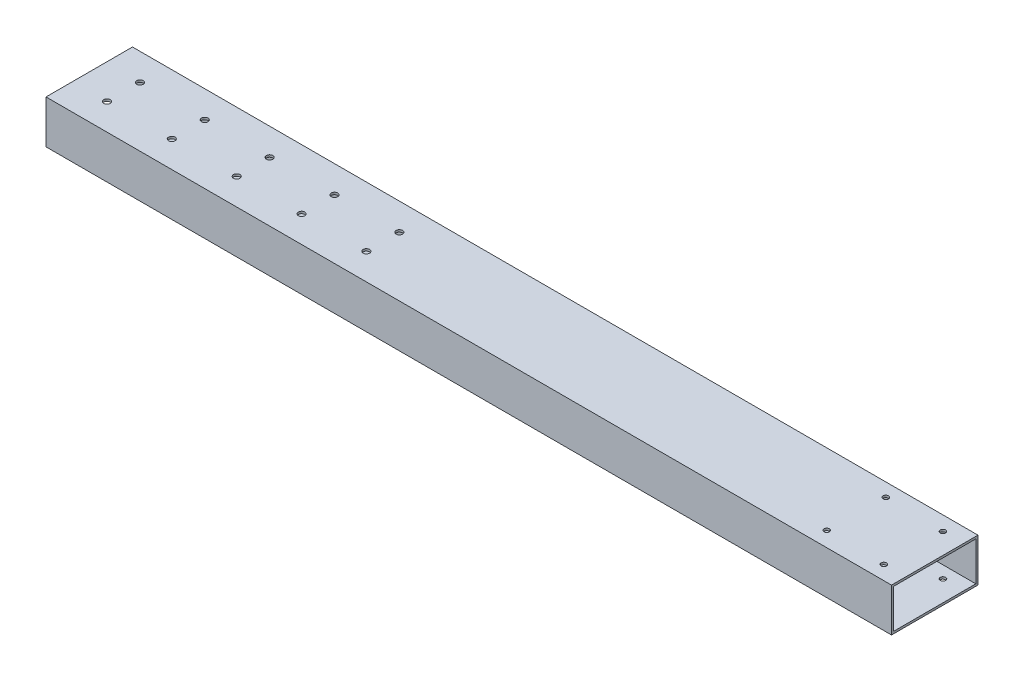
ISO-10303-21;
HEADER;
FILE_DESCRIPTION(('STEP AP214'),'2;1');
FILE_NAME('part.step','',(''),(''),'','','');
FILE_SCHEMA(('AUTOMOTIVE_DESIGN { 1 0 10303 214 1 1 1 1 }'));
ENDSEC;
DATA;
#1=APPLICATION_CONTEXT('core data for automotive mechanical design processes');
#2=APPLICATION_PROTOCOL_DEFINITION('international standard','automotive_design',2000,#1);
#3=PRODUCT_CONTEXT('',#1,'mechanical');
#4=PRODUCT('Part','Part','',(#3));
#5=PRODUCT_RELATED_PRODUCT_CATEGORY('part','',(#4));
#6=PRODUCT_DEFINITION_FORMATION('','',#4);
#7=PRODUCT_DEFINITION_CONTEXT('part definition',#1,'design');
#8=PRODUCT_DEFINITION('design','',#6,#7);
#9=PRODUCT_DEFINITION_SHAPE('','',#8);
#10=(LENGTH_UNIT() NAMED_UNIT(*) SI_UNIT(.MILLI.,.METRE.));
#11=(NAMED_UNIT(*) PLANE_ANGLE_UNIT() SI_UNIT($,.RADIAN.));
#12=(NAMED_UNIT(*) SI_UNIT($,.STERADIAN.) SOLID_ANGLE_UNIT());
#13=UNCERTAINTY_MEASURE_WITH_UNIT(LENGTH_MEASURE(1.E-05),#10,'distance_accuracy_value','');
#14=(GEOMETRIC_REPRESENTATION_CONTEXT(3) GLOBAL_UNCERTAINTY_ASSIGNED_CONTEXT((#13)) GLOBAL_UNIT_ASSIGNED_CONTEXT((#10,
#11,#12)) REPRESENTATION_CONTEXT('',''));
#15=CARTESIAN_POINT('',(0.,0.,0.));
#16=DIRECTION('',(0.,0.,1.));
#17=DIRECTION('',(1.,0.,0.));
#18=AXIS2_PLACEMENT_3D('',#15,#16,#17);
#19=CARTESIAN_POINT('',(391.,0.,0.));
#20=DIRECTION('',(-1.,0.,0.));
#21=DIRECTION('',(0.,0.,1.));
#22=AXIS2_PLACEMENT_3D('',#19,#20,#21);
#23=PLANE('',#22);
#24=DIRECTION('',(0.,1.,0.));
#25=VECTOR('',#24,1.);
#26=CARTESIAN_POINT('',(391.,-10.,-20.));
#27=LINE('',#26,#25);
#28=CARTESIAN_POINT('',(391.,-10.,-20.));
#29=VERTEX_POINT('',#28);
#30=CARTESIAN_POINT('',(391.,10.,-20.));
#31=VERTEX_POINT('',#30);
#32=EDGE_CURVE('E141',#29,#31,#27,.T.);
#33=ORIENTED_EDGE('',*,*,#32,.T.);
#34=DIRECTION('',(0.,0.,1.));
#35=VECTOR('',#34,1.);
#36=CARTESIAN_POINT('',(391.,10.,20.));
#37=LINE('',#36,#35);
#38=CARTESIAN_POINT('',(391.,10.,20.));
#39=VERTEX_POINT('',#38);
#40=EDGE_CURVE('E144',#31,#39,#37,.T.);
#41=ORIENTED_EDGE('',*,*,#40,.T.);
#42=DIRECTION('',(0.,-1.,0.));
#43=VECTOR('',#42,1.);
#44=CARTESIAN_POINT('',(391.,-10.,20.));
#45=LINE('',#44,#43);
#46=CARTESIAN_POINT('',(391.,-10.,20.));
#47=VERTEX_POINT('',#46);
#48=EDGE_CURVE('E147',#39,#47,#45,.T.);
#49=ORIENTED_EDGE('',*,*,#48,.T.);
#50=DIRECTION('',(0.,0.,-1.));
#51=VECTOR('',#50,1.);
#52=CARTESIAN_POINT('',(391.,-10.,20.));
#53=LINE('',#52,#51);
#54=EDGE_CURVE('E149',#47,#29,#53,.T.);
#55=ORIENTED_EDGE('',*,*,#54,.T.);
#56=EDGE_LOOP('',(#33,#41,#49,#55));
#57=FACE_BOUND('',#56,.T.);
#58=DIRECTION('',(0.,1.,0.));
#59=VECTOR('',#58,1.);
#60=CARTESIAN_POINT('',(391.,0.,-19.));
#61=LINE('',#60,#59);
#62=CARTESIAN_POINT('',(391.,-9.00000000000001,-19.));
#63=VERTEX_POINT('',#62);
#64=CARTESIAN_POINT('',(391.,9.,-19.));
#65=VERTEX_POINT('',#64);
#66=EDGE_CURVE('E129',#63,#65,#61,.T.);
#67=ORIENTED_EDGE('',*,*,#66,.F.);
#68=DIRECTION('',(0.,0.,-1.));
#69=VECTOR('',#68,1.);
#70=CARTESIAN_POINT('',(391.,-9.00000000000001,0.));
#71=LINE('',#70,#69);
#72=CARTESIAN_POINT('',(391.,-9.00000000000001,19.));
#73=VERTEX_POINT('',#72);
#74=EDGE_CURVE('E113',#73,#63,#71,.T.);
#75=ORIENTED_EDGE('',*,*,#74,.F.);
#76=DIRECTION('',(0.,-1.,0.));
#77=VECTOR('',#76,1.);
#78=CARTESIAN_POINT('',(391.,0.,19.));
#79=LINE('',#78,#77);
#80=CARTESIAN_POINT('',(391.,9.,19.));
#81=VERTEX_POINT('',#80);
#82=EDGE_CURVE('E138',#81,#73,#79,.T.);
#83=ORIENTED_EDGE('',*,*,#82,.F.);
#84=DIRECTION('',(0.,0.,1.));
#85=VECTOR('',#84,1.);
#86=CARTESIAN_POINT('',(391.,9.,0.));
#87=LINE('',#86,#85);
#88=EDGE_CURVE('E131',#65,#81,#87,.T.);
#89=ORIENTED_EDGE('',*,*,#88,.F.);
#90=EDGE_LOOP('',(#67,#75,#83,#89));
#91=FACE_BOUND('',#90,.T.);
#92=ADVANCED_FACE('F41',(#57,#91),#23,.F.);
#93=CARTESIAN_POINT('',(0.,0.,0.));
#94=DIRECTION('',(-1.,0.,0.));
#95=DIRECTION('',(0.,0.,1.));
#96=AXIS2_PLACEMENT_3D('',#93,#94,#95);
#97=PLANE('',#96);
#98=DIRECTION('',(0.,1.,0.));
#99=VECTOR('',#98,1.);
#100=CARTESIAN_POINT('',(0.,-10.,-20.));
#101=LINE('',#100,#99);
#102=CARTESIAN_POINT('',(0.,-10.,-20.));
#103=VERTEX_POINT('',#102);
#104=CARTESIAN_POINT('',(0.,10.,-20.));
#105=VERTEX_POINT('',#104);
#106=EDGE_CURVE('E152',#103,#105,#101,.T.);
#107=ORIENTED_EDGE('',*,*,#106,.F.);
#108=DIRECTION('',(0.,0.,-1.));
#109=VECTOR('',#108,1.);
#110=CARTESIAN_POINT('',(0.,-10.,20.));
#111=LINE('',#110,#109);
#112=CARTESIAN_POINT('',(0.,-10.,20.));
#113=VERTEX_POINT('',#112);
#114=EDGE_CURVE('E145',#113,#103,#111,.T.);
#115=ORIENTED_EDGE('',*,*,#114,.F.);
#116=DIRECTION('',(0.,-1.,0.));
#117=VECTOR('',#116,1.);
#118=CARTESIAN_POINT('',(0.,-10.,20.));
#119=LINE('',#118,#117);
#120=CARTESIAN_POINT('',(0.,10.,20.));
#121=VERTEX_POINT('',#120);
#122=EDGE_CURVE('E157',#121,#113,#119,.T.);
#123=ORIENTED_EDGE('',*,*,#122,.F.);
#124=DIRECTION('',(0.,0.,1.));
#125=VECTOR('',#124,1.);
#126=CARTESIAN_POINT('',(0.,10.,20.));
#127=LINE('',#126,#125);
#128=EDGE_CURVE('E155',#105,#121,#127,.T.);
#129=ORIENTED_EDGE('',*,*,#128,.F.);
#130=EDGE_LOOP('',(#107,#115,#123,#129));
#131=FACE_BOUND('',#130,.T.);
#132=DIRECTION('',(0.,0.,-1.));
#133=VECTOR('',#132,1.);
#134=CARTESIAN_POINT('',(0.,-9.00000000000001,0.));
#135=LINE('',#134,#133);
#136=CARTESIAN_POINT('',(0.,-9.00000000000001,19.));
#137=VERTEX_POINT('',#136);
#138=CARTESIAN_POINT('',(0.,-9.00000000000001,-19.));
#139=VERTEX_POINT('',#138);
#140=EDGE_CURVE('E111',#137,#139,#135,.T.);
#141=ORIENTED_EDGE('',*,*,#140,.T.);
#142=DIRECTION('',(0.,1.,0.));
#143=VECTOR('',#142,1.);
#144=CARTESIAN_POINT('',(0.,0.,-19.));
#145=LINE('',#144,#143);
#146=CARTESIAN_POINT('',(0.,9.,-19.));
#147=VERTEX_POINT('',#146);
#148=EDGE_CURVE('E119',#139,#147,#145,.T.);
#149=ORIENTED_EDGE('',*,*,#148,.T.);
#150=DIRECTION('',(0.,0.,1.));
#151=VECTOR('',#150,1.);
#152=CARTESIAN_POINT('',(0.,9.,0.));
#153=LINE('',#152,#151);
#154=CARTESIAN_POINT('',(0.,9.,19.));
#155=VERTEX_POINT('',#154);
#156=EDGE_CURVE('E125',#147,#155,#153,.T.);
#157=ORIENTED_EDGE('',*,*,#156,.T.);
#158=DIRECTION('',(0.,-1.,0.));
#159=VECTOR('',#158,1.);
#160=CARTESIAN_POINT('',(0.,0.,19.));
#161=LINE('',#160,#159);
#162=EDGE_CURVE('E65',#155,#137,#161,.T.);
#163=ORIENTED_EDGE('',*,*,#162,.T.);
#164=EDGE_LOOP('',(#141,#149,#157,#163));
#165=FACE_BOUND('',#164,.T.);
#166=ADVANCED_FACE('F128',(#131,#165),#97,.T.);
#167=CARTESIAN_POINT('',(391.,-10.,-20.));
#168=DIRECTION('',(0.,0.,1.));
#169=DIRECTION('',(1.,0.,0.));
#170=AXIS2_PLACEMENT_3D('',#167,#168,#169);
#171=PLANE('',#170);
#172=ORIENTED_EDGE('',*,*,#106,.T.);
#173=DIRECTION('',(-1.,0.,0.));
#174=VECTOR('',#173,1.);
#175=CARTESIAN_POINT('',(391.,10.,-20.));
#176=LINE('',#175,#174);
#177=EDGE_CURVE('E11',#31,#105,#176,.T.);
#178=ORIENTED_EDGE('',*,*,#177,.F.);
#179=ORIENTED_EDGE('',*,*,#32,.F.);
#180=DIRECTION('',(-1.,0.,0.));
#181=VECTOR('',#180,1.);
#182=CARTESIAN_POINT('',(391.,-10.,-20.));
#183=LINE('',#182,#181);
#184=EDGE_CURVE('E151',#29,#103,#183,.T.);
#185=ORIENTED_EDGE('',*,*,#184,.T.);
#186=EDGE_LOOP('',(#172,#178,#179,#185));
#187=FACE_BOUND('',#186,.T.);
#188=ADVANCED_FACE('F43',(#187),#171,.F.);
#189=CARTESIAN_POINT('',(391.,10.,20.));
#190=DIRECTION('',(0.,-1.,0.));
#191=DIRECTION('',(0.,0.,-1.));
#192=AXIS2_PLACEMENT_3D('',#189,#190,#191);
#193=PLANE('',#192);
#194=CARTESIAN_POINT('',(354.086813755245,9.99999999999999,13.0304709307582));
#195=DIRECTION('',(0.,-1.,0.));
#196=DIRECTION('',(0.,0.,-1.));
#197=AXIS2_PLACEMENT_3D('',#194,#195,#196);
#198=CIRCLE('',#197,1.25000000000001);
#199=CARTESIAN_POINT('',(354.086813755245,9.99999999999999,11.7804709307582));
#200=VERTEX_POINT('',#199);
#201=EDGE_CURVE('E248',#200,#200,#198,.T.);
#202=ORIENTED_EDGE('',*,*,#201,.T.);
#203=EDGE_LOOP('',(#202));
#204=FACE_BOUND('',#203,.T.);
#205=CARTESIAN_POINT('',(380.952686424662,9.99999999999999,13.5046920929179));
#206=DIRECTION('',(0.,-1.,0.));
#207=DIRECTION('',(0.,0.,-1.));
#208=AXIS2_PLACEMENT_3D('',#205,#206,#207);
#209=CIRCLE('',#208,1.25000000000001);
#210=CARTESIAN_POINT('',(380.952686424662,9.99999999999999,12.2546920929179));
#211=VERTEX_POINT('',#210);
#212=EDGE_CURVE('E233',#211,#211,#209,.T.);
#213=ORIENTED_EDGE('',*,*,#212,.T.);
#214=EDGE_LOOP('',(#213));
#215=FACE_BOUND('',#214,.T.);
#216=CARTESIAN_POINT('',(381.426907586822,9.99999999999999,-13.3611805764997));
#217=DIRECTION('',(0.,-1.,0.));
#218=DIRECTION('',(0.,0.,-1.));
#219=AXIS2_PLACEMENT_3D('',#216,#217,#218);
#220=CIRCLE('',#219,1.25000000000001);
#221=CARTESIAN_POINT('',(381.426907586822,9.99999999999999,-14.6111805764997));
#222=VERTEX_POINT('',#221);
#223=EDGE_CURVE('E229',#222,#222,#220,.T.);
#224=ORIENTED_EDGE('',*,*,#223,.T.);
#225=EDGE_LOOP('',(#224));
#226=FACE_BOUND('',#225,.T.);
#227=CARTESIAN_POINT('',(354.561034917405,9.99999999999999,-13.8354017386594));
#228=DIRECTION('',(0.,-1.,0.));
#229=DIRECTION('',(0.,0.,-1.));
#230=AXIS2_PLACEMENT_3D('',#227,#228,#229);
#231=CIRCLE('',#230,1.25000000000001);
#232=CARTESIAN_POINT('',(354.561034917405,9.99999999999999,-15.0854017386595));
#233=VERTEX_POINT('',#232);
#234=EDGE_CURVE('E225',#233,#233,#231,.T.);
#235=ORIENTED_EDGE('',*,*,#234,.T.);
#236=EDGE_LOOP('',(#235));
#237=FACE_BOUND('',#236,.T.);
#238=CARTESIAN_POINT('',(45.9211371826209,10.,-7.49540071904418));
#239=DIRECTION('',(0.,1.,0.));
#240=DIRECTION('',(0.,0.,1.));
#241=AXIS2_PLACEMENT_3D('',#238,#239,#240);
#242=CIRCLE('',#241,1.5);
#243=CARTESIAN_POINT('',(45.9211371826209,10.,-5.99540071904417));
#244=VERTEX_POINT('',#243);
#245=EDGE_CURVE('E255',#244,#244,#242,.T.);
#246=ORIENTED_EDGE('',*,*,#245,.F.);
#247=EDGE_LOOP('',(#246));
#248=FACE_BOUND('',#247,.T.);
#249=CARTESIAN_POINT('',(75.9211371826209,10.,-7.49540071904437));
#250=DIRECTION('',(0.,1.,0.));
#251=DIRECTION('',(0.,0.,1.));
#252=AXIS2_PLACEMENT_3D('',#249,#250,#251);
#253=CIRCLE('',#252,1.5);
#254=CARTESIAN_POINT('',(75.9211371826209,10.,-5.99540071904437));
#255=VERTEX_POINT('',#254);
#256=EDGE_CURVE('E258',#255,#255,#253,.T.);
#257=ORIENTED_EDGE('',*,*,#256,.F.);
#258=EDGE_LOOP('',(#257));
#259=FACE_BOUND('',#258,.T.);
#260=CARTESIAN_POINT('',(105.921137182621,10.,-7.49540071904456));
#261=DIRECTION('',(0.,1.,0.));
#262=DIRECTION('',(0.,0.,1.));
#263=AXIS2_PLACEMENT_3D('',#260,#261,#262);
#264=CIRCLE('',#263,1.5);
#265=CARTESIAN_POINT('',(105.921137182621,10.,-5.99540071904457));
#266=VERTEX_POINT('',#265);
#267=EDGE_CURVE('E261',#266,#266,#264,.T.);
#268=ORIENTED_EDGE('',*,*,#267,.F.);
#269=EDGE_LOOP('',(#268));
#270=FACE_BOUND('',#269,.T.);
#271=CARTESIAN_POINT('',(135.921137182621,10.,-7.49540071904476));
#272=DIRECTION('',(0.,1.,0.));
#273=DIRECTION('',(0.,0.,1.));
#274=AXIS2_PLACEMENT_3D('',#271,#272,#273);
#275=CIRCLE('',#274,1.5);
#276=CARTESIAN_POINT('',(135.921137182621,10.,-5.99540071904476));
#277=VERTEX_POINT('',#276);
#278=EDGE_CURVE('E264',#277,#277,#275,.T.);
#279=ORIENTED_EDGE('',*,*,#278,.F.);
#280=EDGE_LOOP('',(#279));
#281=FACE_BOUND('',#280,.T.);
#282=CARTESIAN_POINT('',(15.921137182621,10.,7.73575633829602));
#283=DIRECTION('',(0.,1.,0.));
#284=DIRECTION('',(0.,0.,1.));
#285=AXIS2_PLACEMENT_3D('',#282,#283,#284);
#286=CIRCLE('',#285,1.5);
#287=CARTESIAN_POINT('',(15.921137182621,10.,9.23575633829602));
#288=VERTEX_POINT('',#287);
#289=EDGE_CURVE('E267',#288,#288,#286,.T.);
#290=ORIENTED_EDGE('',*,*,#289,.F.);
#291=EDGE_LOOP('',(#290));
#292=FACE_BOUND('',#291,.T.);
#293=CARTESIAN_POINT('',(45.921137182621,10.,7.73575633829583));
#294=DIRECTION('',(0.,1.,0.));
#295=DIRECTION('',(0.,0.,1.));
#296=AXIS2_PLACEMENT_3D('',#293,#294,#295);
#297=CIRCLE('',#296,1.5);
#298=CARTESIAN_POINT('',(45.921137182621,10.,9.23575633829583));
#299=VERTEX_POINT('',#298);
#300=EDGE_CURVE('E270',#299,#299,#297,.T.);
#301=ORIENTED_EDGE('',*,*,#300,.F.);
#302=EDGE_LOOP('',(#301));
#303=FACE_BOUND('',#302,.T.);
#304=CARTESIAN_POINT('',(75.921137182621,10.,7.73575633829563));
#305=DIRECTION('',(0.,1.,0.));
#306=DIRECTION('',(0.,0.,1.));
#307=AXIS2_PLACEMENT_3D('',#304,#305,#306);
#308=CIRCLE('',#307,1.5);
#309=CARTESIAN_POINT('',(75.921137182621,10.,9.23575633829563));
#310=VERTEX_POINT('',#309);
#311=EDGE_CURVE('E273',#310,#310,#308,.T.);
#312=ORIENTED_EDGE('',*,*,#311,.F.);
#313=EDGE_LOOP('',(#312));
#314=FACE_BOUND('',#313,.T.);
#315=CARTESIAN_POINT('',(105.921137182621,10.,7.73575633829544));
#316=DIRECTION('',(0.,1.,0.));
#317=DIRECTION('',(0.,0.,1.));
#318=AXIS2_PLACEMENT_3D('',#315,#316,#317);
#319=CIRCLE('',#318,1.5);
#320=CARTESIAN_POINT('',(105.921137182621,10.,9.23575633829543));
#321=VERTEX_POINT('',#320);
#322=EDGE_CURVE('E254',#321,#321,#319,.T.);
#323=ORIENTED_EDGE('',*,*,#322,.F.);
#324=EDGE_LOOP('',(#323));
#325=FACE_BOUND('',#324,.T.);
#326=CARTESIAN_POINT('',(135.921137182621,10.,7.73575633829525));
#327=DIRECTION('',(0.,1.,0.));
#328=DIRECTION('',(0.,0.,1.));
#329=AXIS2_PLACEMENT_3D('',#326,#327,#328);
#330=CIRCLE('',#329,1.5);
#331=CARTESIAN_POINT('',(135.921137182621,10.,9.23575633829524));
#332=VERTEX_POINT('',#331);
#333=EDGE_CURVE('E251',#332,#332,#330,.T.);
#334=ORIENTED_EDGE('',*,*,#333,.F.);
#335=EDGE_LOOP('',(#334));
#336=FACE_BOUND('',#335,.T.);
#337=CARTESIAN_POINT('',(15.9211371826209,10.,-7.49540071904398));
#338=DIRECTION('',(0.,1.,0.));
#339=DIRECTION('',(0.,0.,1.));
#340=AXIS2_PLACEMENT_3D('',#337,#338,#339);
#341=CIRCLE('',#340,1.5);
#342=CARTESIAN_POINT('',(15.9211371826209,10.,-5.99540071904398));
#343=VERTEX_POINT('',#342);
#344=EDGE_CURVE('E171',#343,#343,#341,.T.);
#345=ORIENTED_EDGE('',*,*,#344,.F.);
#346=EDGE_LOOP('',(#345));
#347=FACE_BOUND('',#346,.T.);
#348=ORIENTED_EDGE('',*,*,#128,.T.);
#349=DIRECTION('',(-1.,0.,0.));
#350=VECTOR('',#349,1.);
#351=CARTESIAN_POINT('',(391.,10.,20.));
#352=LINE('',#351,#350);
#353=EDGE_CURVE('E50',#39,#121,#352,.T.);
#354=ORIENTED_EDGE('',*,*,#353,.F.);
#355=ORIENTED_EDGE('',*,*,#40,.F.);
#356=ORIENTED_EDGE('',*,*,#177,.T.);
#357=EDGE_LOOP('',(#348,#354,#355,#356));
#358=FACE_BOUND('',#357,.T.);
#359=ADVANCED_FACE('F356',(#204,#215,#226,#237,#248,#259,#270,#281,#292,#303,#314,#325,#336,
#347,#358),#193,.F.);
#360=CARTESIAN_POINT('',(391.,-10.,20.));
#361=DIRECTION('',(0.,0.,-1.));
#362=DIRECTION('',(-1.,0.,0.));
#363=AXIS2_PLACEMENT_3D('',#360,#361,#362);
#364=PLANE('',#363);
#365=ORIENTED_EDGE('',*,*,#122,.T.);
#366=DIRECTION('',(-1.,0.,0.));
#367=VECTOR('',#366,1.);
#368=CARTESIAN_POINT('',(391.,-10.,20.));
#369=LINE('',#368,#367);
#370=EDGE_CURVE('E162',#47,#113,#369,.T.);
#371=ORIENTED_EDGE('',*,*,#370,.F.);
#372=ORIENTED_EDGE('',*,*,#48,.F.);
#373=ORIENTED_EDGE('',*,*,#353,.T.);
#374=EDGE_LOOP('',(#365,#371,#372,#373));
#375=FACE_BOUND('',#374,.T.);
#376=ADVANCED_FACE('F354',(#375),#364,.F.);
#377=CARTESIAN_POINT('',(391.,-10.,20.));
#378=DIRECTION('',(0.,1.,0.));
#379=DIRECTION('',(0.,0.,1.));
#380=AXIS2_PLACEMENT_3D('',#377,#378,#379);
#381=PLANE('',#380);
#382=CARTESIAN_POINT('',(354.086813755245,-10.,13.0304709307582));
#383=DIRECTION('',(0.,-1.,0.));
#384=DIRECTION('',(0.,0.,-1.));
#385=AXIS2_PLACEMENT_3D('',#382,#383,#384);
#386=CIRCLE('',#385,1.25000000000001);
#387=CARTESIAN_POINT('',(354.086813755245,-10.,11.7804709307582));
#388=VERTEX_POINT('',#387);
#389=EDGE_CURVE('E801',#388,#388,#386,.T.);
#390=ORIENTED_EDGE('',*,*,#389,.F.);
#391=EDGE_LOOP('',(#390));
#392=FACE_BOUND('',#391,.T.);
#393=CARTESIAN_POINT('',(380.952686424662,-10.,13.5046920929179));
#394=DIRECTION('',(0.,-1.,0.));
#395=DIRECTION('',(0.,0.,-1.));
#396=AXIS2_PLACEMENT_3D('',#393,#394,#395);
#397=CIRCLE('',#396,1.25000000000001);
#398=CARTESIAN_POINT('',(380.952686424662,-10.,12.2546920929179));
#399=VERTEX_POINT('',#398);
#400=EDGE_CURVE('E804',#399,#399,#397,.T.);
#401=ORIENTED_EDGE('',*,*,#400,.F.);
#402=EDGE_LOOP('',(#401));
#403=FACE_BOUND('',#402,.T.);
#404=CARTESIAN_POINT('',(381.426907586822,-10.,-13.3611805764997));
#405=DIRECTION('',(0.,-1.,0.));
#406=DIRECTION('',(0.,0.,-1.));
#407=AXIS2_PLACEMENT_3D('',#404,#405,#406);
#408=CIRCLE('',#407,1.25000000000001);
#409=CARTESIAN_POINT('',(381.426907586822,-10.,-14.6111805764997));
#410=VERTEX_POINT('',#409);
#411=EDGE_CURVE('E800',#410,#410,#408,.T.);
#412=ORIENTED_EDGE('',*,*,#411,.F.);
#413=EDGE_LOOP('',(#412));
#414=FACE_BOUND('',#413,.T.);
#415=CARTESIAN_POINT('',(354.561034917405,-10.,-13.8354017386594));
#416=DIRECTION('',(0.,-1.,0.));
#417=DIRECTION('',(0.,0.,-1.));
#418=AXIS2_PLACEMENT_3D('',#415,#416,#417);
#419=CIRCLE('',#418,1.25000000000001);
#420=CARTESIAN_POINT('',(354.561034917405,-10.,-15.0854017386595));
#421=VERTEX_POINT('',#420);
#422=EDGE_CURVE('E221',#421,#421,#419,.T.);
#423=ORIENTED_EDGE('',*,*,#422,.F.);
#424=EDGE_LOOP('',(#423));
#425=FACE_BOUND('',#424,.T.);
#426=CARTESIAN_POINT('',(45.9211371826209,-10.,-7.49540071904418));
#427=DIRECTION('',(0.,1.,0.));
#428=DIRECTION('',(0.,0.,1.));
#429=AXIS2_PLACEMENT_3D('',#426,#427,#428);
#430=CIRCLE('',#429,1.5);
#431=CARTESIAN_POINT('',(45.9211371826209,-10.,-5.99540071904417));
#432=VERTEX_POINT('',#431);
#433=EDGE_CURVE('E126',#432,#432,#430,.T.);
#434=ORIENTED_EDGE('',*,*,#433,.T.);
#435=EDGE_LOOP('',(#434));
#436=FACE_BOUND('',#435,.T.);
#437=CARTESIAN_POINT('',(75.9211371826209,-10.,-7.49540071904437));
#438=DIRECTION('',(0.,1.,0.));
#439=DIRECTION('',(0.,0.,1.));
#440=AXIS2_PLACEMENT_3D('',#437,#438,#439);
#441=CIRCLE('',#440,1.5);
#442=CARTESIAN_POINT('',(75.9211371826209,-10.,-5.99540071904437));
#443=VERTEX_POINT('',#442);
#444=EDGE_CURVE('E216',#443,#443,#441,.T.);
#445=ORIENTED_EDGE('',*,*,#444,.T.);
#446=EDGE_LOOP('',(#445));
#447=FACE_BOUND('',#446,.T.);
#448=CARTESIAN_POINT('',(105.921137182621,-10.,-7.49540071904456));
#449=DIRECTION('',(0.,1.,0.));
#450=DIRECTION('',(0.,0.,1.));
#451=AXIS2_PLACEMENT_3D('',#448,#449,#450);
#452=CIRCLE('',#451,1.5);
#453=CARTESIAN_POINT('',(105.921137182621,-10.,-5.99540071904457));
#454=VERTEX_POINT('',#453);
#455=EDGE_CURVE('E211',#454,#454,#452,.T.);
#456=ORIENTED_EDGE('',*,*,#455,.T.);
#457=EDGE_LOOP('',(#456));
#458=FACE_BOUND('',#457,.T.);
#459=CARTESIAN_POINT('',(135.921137182621,-10.,-7.49540071904476));
#460=DIRECTION('',(0.,1.,0.));
#461=DIRECTION('',(0.,0.,1.));
#462=AXIS2_PLACEMENT_3D('',#459,#460,#461);
#463=CIRCLE('',#462,1.5);
#464=CARTESIAN_POINT('',(135.921137182621,-10.,-5.99540071904476));
#465=VERTEX_POINT('',#464);
#466=EDGE_CURVE('E206',#465,#465,#463,.T.);
#467=ORIENTED_EDGE('',*,*,#466,.T.);
#468=EDGE_LOOP('',(#467));
#469=FACE_BOUND('',#468,.T.);
#470=CARTESIAN_POINT('',(15.921137182621,-10.,7.73575633829602));
#471=DIRECTION('',(0.,1.,0.));
#472=DIRECTION('',(0.,0.,1.));
#473=AXIS2_PLACEMENT_3D('',#470,#471,#472);
#474=CIRCLE('',#473,1.5);
#475=CARTESIAN_POINT('',(15.921137182621,-10.,9.23575633829602));
#476=VERTEX_POINT('',#475);
#477=EDGE_CURVE('E201',#476,#476,#474,.T.);
#478=ORIENTED_EDGE('',*,*,#477,.T.);
#479=EDGE_LOOP('',(#478));
#480=FACE_BOUND('',#479,.T.);
#481=CARTESIAN_POINT('',(45.921137182621,-10.,7.73575633829583));
#482=DIRECTION('',(0.,1.,0.));
#483=DIRECTION('',(0.,0.,1.));
#484=AXIS2_PLACEMENT_3D('',#481,#482,#483);
#485=CIRCLE('',#484,1.5);
#486=CARTESIAN_POINT('',(45.921137182621,-10.,9.23575633829583));
#487=VERTEX_POINT('',#486);
#488=EDGE_CURVE('E196',#487,#487,#485,.T.);
#489=ORIENTED_EDGE('',*,*,#488,.T.);
#490=EDGE_LOOP('',(#489));
#491=FACE_BOUND('',#490,.T.);
#492=CARTESIAN_POINT('',(75.921137182621,-10.,7.73575633829563));
#493=DIRECTION('',(0.,1.,0.));
#494=DIRECTION('',(0.,0.,1.));
#495=AXIS2_PLACEMENT_3D('',#492,#493,#494);
#496=CIRCLE('',#495,1.5);
#497=CARTESIAN_POINT('',(75.921137182621,-10.,9.23575633829563));
#498=VERTEX_POINT('',#497);
#499=EDGE_CURVE('E191',#498,#498,#496,.T.);
#500=ORIENTED_EDGE('',*,*,#499,.T.);
#501=EDGE_LOOP('',(#500));
#502=FACE_BOUND('',#501,.T.);
#503=CARTESIAN_POINT('',(105.921137182621,-10.,7.73575633829544));
#504=DIRECTION('',(0.,1.,0.));
#505=DIRECTION('',(0.,0.,1.));
#506=AXIS2_PLACEMENT_3D('',#503,#504,#505);
#507=CIRCLE('',#506,1.5);
#508=CARTESIAN_POINT('',(105.921137182621,-10.,9.23575633829543));
#509=VERTEX_POINT('',#508);
#510=EDGE_CURVE('E186',#509,#509,#507,.T.);
#511=ORIENTED_EDGE('',*,*,#510,.T.);
#512=EDGE_LOOP('',(#511));
#513=FACE_BOUND('',#512,.T.);
#514=CARTESIAN_POINT('',(135.921137182621,-10.,7.73575633829525));
#515=DIRECTION('',(0.,1.,0.));
#516=DIRECTION('',(0.,0.,1.));
#517=AXIS2_PLACEMENT_3D('',#514,#515,#516);
#518=CIRCLE('',#517,1.5);
#519=CARTESIAN_POINT('',(135.921137182621,-10.,9.23575633829524));
#520=VERTEX_POINT('',#519);
#521=EDGE_CURVE('E181',#520,#520,#518,.T.);
#522=ORIENTED_EDGE('',*,*,#521,.T.);
#523=EDGE_LOOP('',(#522));
#524=FACE_BOUND('',#523,.T.);
#525=CARTESIAN_POINT('',(15.9211371826209,-10.,-7.49540071904398));
#526=DIRECTION('',(0.,1.,0.));
#527=DIRECTION('',(0.,0.,1.));
#528=AXIS2_PLACEMENT_3D('',#525,#526,#527);
#529=CIRCLE('',#528,1.5);
#530=CARTESIAN_POINT('',(15.9211371826209,-10.,-5.99540071904398));
#531=VERTEX_POINT('',#530);
#532=EDGE_CURVE('E176',#531,#531,#529,.T.);
#533=ORIENTED_EDGE('',*,*,#532,.T.);
#534=EDGE_LOOP('',(#533));
#535=FACE_BOUND('',#534,.T.);
#536=ORIENTED_EDGE('',*,*,#114,.T.);
#537=ORIENTED_EDGE('',*,*,#184,.F.);
#538=ORIENTED_EDGE('',*,*,#54,.F.);
#539=ORIENTED_EDGE('',*,*,#370,.T.);
#540=EDGE_LOOP('',(#536,#537,#538,#539));
#541=FACE_BOUND('',#540,.T.);
#542=ADVANCED_FACE('F338',(#392,#403,#414,#425,#436,#447,#458,#469,#480,#491,#502,#513,#524,
#535,#541),#381,.F.);
#543=CARTESIAN_POINT('',(391.,-10.,-19.));
#544=DIRECTION('',(0.,0.,1.));
#545=DIRECTION('',(1.,0.,0.));
#546=AXIS2_PLACEMENT_3D('',#543,#544,#545);
#547=PLANE('',#546);
#548=ORIENTED_EDGE('',*,*,#148,.F.);
#549=DIRECTION('',(-1.,0.,0.));
#550=VECTOR('',#549,1.);
#551=CARTESIAN_POINT('',(391.,-9.00000000000001,-19.));
#552=LINE('',#551,#550);
#553=EDGE_CURVE('E107',#63,#139,#552,.T.);
#554=ORIENTED_EDGE('',*,*,#553,.F.);
#555=ORIENTED_EDGE('',*,*,#66,.T.);
#556=DIRECTION('',(-1.,0.,0.));
#557=VECTOR('',#556,1.);
#558=CARTESIAN_POINT('',(391.,9.,-19.));
#559=LINE('',#558,#557);
#560=EDGE_CURVE('E122',#65,#147,#559,.T.);
#561=ORIENTED_EDGE('',*,*,#560,.T.);
#562=EDGE_LOOP('',(#548,#554,#555,#561));
#563=FACE_BOUND('',#562,.T.);
#564=ADVANCED_FACE('F120',(#563),#547,.T.);
#565=CARTESIAN_POINT('',(391.,9.,20.));
#566=DIRECTION('',(0.,-1.,0.));
#567=DIRECTION('',(0.,0.,-1.));
#568=AXIS2_PLACEMENT_3D('',#565,#566,#567);
#569=PLANE('',#568);
#570=CARTESIAN_POINT('',(354.086813755245,9.,13.0304709307582));
#571=DIRECTION('',(0.,-1.,0.));
#572=DIRECTION('',(0.,0.,-1.));
#573=AXIS2_PLACEMENT_3D('',#570,#571,#572);
#574=CIRCLE('',#573,1.25000000000001);
#575=CARTESIAN_POINT('',(354.086813755245,9.,11.7804709307582));
#576=VERTEX_POINT('',#575);
#577=EDGE_CURVE('E245',#576,#576,#574,.T.);
#578=ORIENTED_EDGE('',*,*,#577,.F.);
#579=EDGE_LOOP('',(#578));
#580=FACE_BOUND('',#579,.T.);
#581=CARTESIAN_POINT('',(380.952686424662,9.,13.5046920929179));
#582=DIRECTION('',(0.,-1.,0.));
#583=DIRECTION('',(0.,0.,-1.));
#584=AXIS2_PLACEMENT_3D('',#581,#582,#583);
#585=CIRCLE('',#584,1.25000000000001);
#586=CARTESIAN_POINT('',(380.952686424662,9.,12.2546920929179));
#587=VERTEX_POINT('',#586);
#588=EDGE_CURVE('E228',#587,#587,#585,.T.);
#589=ORIENTED_EDGE('',*,*,#588,.F.);
#590=EDGE_LOOP('',(#589));
#591=FACE_BOUND('',#590,.T.);
#592=CARTESIAN_POINT('',(381.426907586822,9.,-13.3611805764997));
#593=DIRECTION('',(0.,-1.,0.));
#594=DIRECTION('',(0.,0.,-1.));
#595=AXIS2_PLACEMENT_3D('',#592,#593,#594);
#596=CIRCLE('',#595,1.25000000000001);
#597=CARTESIAN_POINT('',(381.426907586822,9.,-14.6111805764997));
#598=VERTEX_POINT('',#597);
#599=EDGE_CURVE('E224',#598,#598,#596,.T.);
#600=ORIENTED_EDGE('',*,*,#599,.F.);
#601=EDGE_LOOP('',(#600));
#602=FACE_BOUND('',#601,.T.);
#603=CARTESIAN_POINT('',(354.561034917405,9.,-13.8354017386594));
#604=DIRECTION('',(0.,-1.,0.));
#605=DIRECTION('',(0.,0.,-1.));
#606=AXIS2_PLACEMENT_3D('',#603,#604,#605);
#607=CIRCLE('',#606,1.25000000000001);
#608=CARTESIAN_POINT('',(354.561034917405,9.,-15.0854017386595));
#609=VERTEX_POINT('',#608);
#610=EDGE_CURVE('E220',#609,#609,#607,.T.);
#611=ORIENTED_EDGE('',*,*,#610,.F.);
#612=EDGE_LOOP('',(#611));
#613=FACE_BOUND('',#612,.T.);
#614=CARTESIAN_POINT('',(45.9211371826209,8.99999999999999,-7.49540071904418));
#615=DIRECTION('',(0.,-1.,0.));
#616=DIRECTION('',(0.,0.,-1.));
#617=AXIS2_PLACEMENT_3D('',#614,#615,#616);
#618=CIRCLE('',#617,1.5);
#619=CARTESIAN_POINT('',(45.9211371826209,8.99999999999999,-8.99540071904418));
#620=VERTEX_POINT('',#619);
#621=EDGE_CURVE('E215',#620,#620,#618,.T.);
#622=ORIENTED_EDGE('',*,*,#621,.F.);
#623=EDGE_LOOP('',(#622));
#624=FACE_BOUND('',#623,.T.);
#625=CARTESIAN_POINT('',(75.9211371826209,8.99999999999999,-7.49540071904437));
#626=DIRECTION('',(0.,-1.,0.));
#627=DIRECTION('',(0.,0.,-1.));
#628=AXIS2_PLACEMENT_3D('',#625,#626,#627);
#629=CIRCLE('',#628,1.5);
#630=CARTESIAN_POINT('',(75.9211371826209,8.99999999999999,-8.99540071904437));
#631=VERTEX_POINT('',#630);
#632=EDGE_CURVE('E210',#631,#631,#629,.T.);
#633=ORIENTED_EDGE('',*,*,#632,.F.);
#634=EDGE_LOOP('',(#633));
#635=FACE_BOUND('',#634,.T.);
#636=CARTESIAN_POINT('',(105.921137182621,8.99999999999999,-7.49540071904456));
#637=DIRECTION('',(0.,-1.,0.));
#638=DIRECTION('',(0.,0.,-1.));
#639=AXIS2_PLACEMENT_3D('',#636,#637,#638);
#640=CIRCLE('',#639,1.5);
#641=CARTESIAN_POINT('',(105.921137182621,8.99999999999999,-8.99540071904456));
#642=VERTEX_POINT('',#641);
#643=EDGE_CURVE('E205',#642,#642,#640,.T.);
#644=ORIENTED_EDGE('',*,*,#643,.F.);
#645=EDGE_LOOP('',(#644));
#646=FACE_BOUND('',#645,.T.);
#647=CARTESIAN_POINT('',(135.921137182621,8.99999999999999,-7.49540071904476));
#648=DIRECTION('',(0.,-1.,0.));
#649=DIRECTION('',(0.,0.,-1.));
#650=AXIS2_PLACEMENT_3D('',#647,#648,#649);
#651=CIRCLE('',#650,1.5);
#652=CARTESIAN_POINT('',(135.921137182621,8.99999999999999,-8.99540071904476));
#653=VERTEX_POINT('',#652);
#654=EDGE_CURVE('E200',#653,#653,#651,.T.);
#655=ORIENTED_EDGE('',*,*,#654,.F.);
#656=EDGE_LOOP('',(#655));
#657=FACE_BOUND('',#656,.T.);
#658=CARTESIAN_POINT('',(15.921137182621,8.99999999999999,7.73575633829602));
#659=DIRECTION('',(0.,-1.,0.));
#660=DIRECTION('',(0.,0.,-1.));
#661=AXIS2_PLACEMENT_3D('',#658,#659,#660);
#662=CIRCLE('',#661,1.5);
#663=CARTESIAN_POINT('',(15.921137182621,8.99999999999999,6.23575633829602));
#664=VERTEX_POINT('',#663);
#665=EDGE_CURVE('E195',#664,#664,#662,.T.);
#666=ORIENTED_EDGE('',*,*,#665,.F.);
#667=EDGE_LOOP('',(#666));
#668=FACE_BOUND('',#667,.T.);
#669=CARTESIAN_POINT('',(45.921137182621,8.99999999999999,7.73575633829583));
#670=DIRECTION('',(0.,-1.,0.));
#671=DIRECTION('',(0.,0.,-1.));
#672=AXIS2_PLACEMENT_3D('',#669,#670,#671);
#673=CIRCLE('',#672,1.5);
#674=CARTESIAN_POINT('',(45.921137182621,8.99999999999999,6.23575633829582));
#675=VERTEX_POINT('',#674);
#676=EDGE_CURVE('E190',#675,#675,#673,.T.);
#677=ORIENTED_EDGE('',*,*,#676,.F.);
#678=EDGE_LOOP('',(#677));
#679=FACE_BOUND('',#678,.T.);
#680=CARTESIAN_POINT('',(75.921137182621,8.99999999999999,7.73575633829563));
#681=DIRECTION('',(0.,-1.,0.));
#682=DIRECTION('',(0.,0.,-1.));
#683=AXIS2_PLACEMENT_3D('',#680,#681,#682);
#684=CIRCLE('',#683,1.5);
#685=CARTESIAN_POINT('',(75.921137182621,8.99999999999999,6.23575633829563));
#686=VERTEX_POINT('',#685);
#687=EDGE_CURVE('E185',#686,#686,#684,.T.);
#688=ORIENTED_EDGE('',*,*,#687,.F.);
#689=EDGE_LOOP('',(#688));
#690=FACE_BOUND('',#689,.T.);
#691=CARTESIAN_POINT('',(105.921137182621,8.99999999999999,7.73575633829544));
#692=DIRECTION('',(0.,-1.,0.));
#693=DIRECTION('',(0.,0.,-1.));
#694=AXIS2_PLACEMENT_3D('',#691,#692,#693);
#695=CIRCLE('',#694,1.5);
#696=CARTESIAN_POINT('',(105.921137182621,8.99999999999999,6.23575633829544));
#697=VERTEX_POINT('',#696);
#698=EDGE_CURVE('E180',#697,#697,#695,.T.);
#699=ORIENTED_EDGE('',*,*,#698,.F.);
#700=EDGE_LOOP('',(#699));
#701=FACE_BOUND('',#700,.T.);
#702=CARTESIAN_POINT('',(135.921137182621,8.99999999999999,7.73575633829525));
#703=DIRECTION('',(0.,-1.,0.));
#704=DIRECTION('',(0.,0.,-1.));
#705=AXIS2_PLACEMENT_3D('',#702,#703,#704);
#706=CIRCLE('',#705,1.5);
#707=CARTESIAN_POINT('',(135.921137182621,8.99999999999999,6.23575633829525));
#708=VERTEX_POINT('',#707);
#709=EDGE_CURVE('E175',#708,#708,#706,.T.);
#710=ORIENTED_EDGE('',*,*,#709,.F.);
#711=EDGE_LOOP('',(#710));
#712=FACE_BOUND('',#711,.T.);
#713=CARTESIAN_POINT('',(15.9211371826209,8.99999999999999,-7.49540071904398));
#714=DIRECTION('',(0.,-1.,0.));
#715=DIRECTION('',(0.,0.,-1.));
#716=AXIS2_PLACEMENT_3D('',#713,#714,#715);
#717=CIRCLE('',#716,1.5);
#718=CARTESIAN_POINT('',(15.9211371826209,8.99999999999999,-8.99540071904399));
#719=VERTEX_POINT('',#718);
#720=EDGE_CURVE('E170',#719,#719,#717,.T.);
#721=ORIENTED_EDGE('',*,*,#720,.F.);
#722=EDGE_LOOP('',(#721));
#723=FACE_BOUND('',#722,.T.);
#724=ORIENTED_EDGE('',*,*,#156,.F.);
#725=ORIENTED_EDGE('',*,*,#560,.F.);
#726=ORIENTED_EDGE('',*,*,#88,.T.);
#727=DIRECTION('',(-1.,0.,0.));
#728=VECTOR('',#727,1.);
#729=CARTESIAN_POINT('',(391.,9.,19.));
#730=LINE('',#729,#728);
#731=EDGE_CURVE('E320',#81,#155,#730,.T.);
#732=ORIENTED_EDGE('',*,*,#731,.T.);
#733=EDGE_LOOP('',(#724,#725,#726,#732));
#734=FACE_BOUND('',#733,.T.);
#735=ADVANCED_FACE('F327',(#580,#591,#602,#613,#624,#635,#646,#657,#668,#679,#690,#701,#712,
#723,#734),#569,.T.);
#736=CARTESIAN_POINT('',(391.,-10.,19.));
#737=DIRECTION('',(0.,0.,-1.));
#738=DIRECTION('',(-1.,0.,0.));
#739=AXIS2_PLACEMENT_3D('',#736,#737,#738);
#740=PLANE('',#739);
#741=ORIENTED_EDGE('',*,*,#162,.F.);
#742=ORIENTED_EDGE('',*,*,#731,.F.);
#743=ORIENTED_EDGE('',*,*,#82,.T.);
#744=DIRECTION('',(-1.,0.,0.));
#745=VECTOR('',#744,1.);
#746=CARTESIAN_POINT('',(391.,-9.00000000000001,19.));
#747=LINE('',#746,#745);
#748=EDGE_CURVE('E58',#73,#137,#747,.T.);
#749=ORIENTED_EDGE('',*,*,#748,.T.);
#750=EDGE_LOOP('',(#741,#742,#743,#749));
#751=FACE_BOUND('',#750,.T.);
#752=ADVANCED_FACE('F322',(#751),#740,.T.);
#753=CARTESIAN_POINT('',(391.,-9.00000000000001,20.));
#754=DIRECTION('',(0.,1.,0.));
#755=DIRECTION('',(0.,0.,1.));
#756=AXIS2_PLACEMENT_3D('',#753,#754,#755);
#757=PLANE('',#756);
#758=CARTESIAN_POINT('',(354.086813755245,-9.00000000000001,13.0304709307582));
#759=DIRECTION('',(0.,1.,0.));
#760=DIRECTION('',(0.,0.,1.));
#761=AXIS2_PLACEMENT_3D('',#758,#759,#760);
#762=CIRCLE('',#761,1.25000000000001);
#763=CARTESIAN_POINT('',(354.086813755245,-9.00000000000001,14.2804709307582));
#764=VERTEX_POINT('',#763);
#765=EDGE_CURVE('E45',#764,#764,#762,.T.);
#766=ORIENTED_EDGE('',*,*,#765,.F.);
#767=EDGE_LOOP('',(#766));
#768=FACE_BOUND('',#767,.T.);
#769=CARTESIAN_POINT('',(380.952686424662,-9.00000000000001,13.5046920929179));
#770=DIRECTION('',(0.,1.,0.));
#771=DIRECTION('',(0.,0.,1.));
#772=AXIS2_PLACEMENT_3D('',#769,#770,#771);
#773=CIRCLE('',#772,1.25000000000001);
#774=CARTESIAN_POINT('',(380.952686424662,-9.00000000000001,14.754692092918));
#775=VERTEX_POINT('',#774);
#776=EDGE_CURVE('E226',#775,#775,#773,.T.);
#777=ORIENTED_EDGE('',*,*,#776,.F.);
#778=EDGE_LOOP('',(#777));
#779=FACE_BOUND('',#778,.T.);
#780=CARTESIAN_POINT('',(381.426907586822,-9.00000000000001,-13.3611805764997));
#781=DIRECTION('',(0.,1.,0.));
#782=DIRECTION('',(0.,0.,1.));
#783=AXIS2_PLACEMENT_3D('',#780,#781,#782);
#784=CIRCLE('',#783,1.25000000000001);
#785=CARTESIAN_POINT('',(381.426907586822,-9.00000000000001,-12.1111805764997));
#786=VERTEX_POINT('',#785);
#787=EDGE_CURVE('E222',#786,#786,#784,.T.);
#788=ORIENTED_EDGE('',*,*,#787,.F.);
#789=EDGE_LOOP('',(#788));
#790=FACE_BOUND('',#789,.T.);
#791=CARTESIAN_POINT('',(354.561034917405,-9.00000000000001,-13.8354017386594));
#792=DIRECTION('',(0.,1.,0.));
#793=DIRECTION('',(0.,0.,1.));
#794=AXIS2_PLACEMENT_3D('',#791,#792,#793);
#795=CIRCLE('',#794,1.25000000000001);
#796=CARTESIAN_POINT('',(354.561034917405,-9.00000000000001,-12.5854017386594));
#797=VERTEX_POINT('',#796);
#798=EDGE_CURVE('E217',#797,#797,#795,.T.);
#799=ORIENTED_EDGE('',*,*,#798,.F.);
#800=EDGE_LOOP('',(#799));
#801=FACE_BOUND('',#800,.T.);
#802=CARTESIAN_POINT('',(45.9211371826209,-9.00000000000001,-7.49540071904418));
#803=DIRECTION('',(0.,1.,0.));
#804=DIRECTION('',(0.,0.,1.));
#805=AXIS2_PLACEMENT_3D('',#802,#803,#804);
#806=CIRCLE('',#805,1.5);
#807=CARTESIAN_POINT('',(45.9211371826209,-9.00000000000001,-5.99540071904417));
#808=VERTEX_POINT('',#807);
#809=EDGE_CURVE('E212',#808,#808,#806,.T.);
#810=ORIENTED_EDGE('',*,*,#809,.F.);
#811=EDGE_LOOP('',(#810));
#812=FACE_BOUND('',#811,.T.);
#813=CARTESIAN_POINT('',(75.9211371826209,-9.00000000000001,-7.49540071904437));
#814=DIRECTION('',(0.,1.,0.));
#815=DIRECTION('',(0.,0.,1.));
#816=AXIS2_PLACEMENT_3D('',#813,#814,#815);
#817=CIRCLE('',#816,1.5);
#818=CARTESIAN_POINT('',(75.9211371826209,-9.00000000000001,-5.99540071904437));
#819=VERTEX_POINT('',#818);
#820=EDGE_CURVE('E207',#819,#819,#817,.T.);
#821=ORIENTED_EDGE('',*,*,#820,.F.);
#822=EDGE_LOOP('',(#821));
#823=FACE_BOUND('',#822,.T.);
#824=CARTESIAN_POINT('',(105.921137182621,-9.00000000000001,-7.49540071904456));
#825=DIRECTION('',(0.,1.,0.));
#826=DIRECTION('',(0.,0.,1.));
#827=AXIS2_PLACEMENT_3D('',#824,#825,#826);
#828=CIRCLE('',#827,1.5);
#829=CARTESIAN_POINT('',(105.921137182621,-9.00000000000001,-5.99540071904457));
#830=VERTEX_POINT('',#829);
#831=EDGE_CURVE('E202',#830,#830,#828,.T.);
#832=ORIENTED_EDGE('',*,*,#831,.F.);
#833=EDGE_LOOP('',(#832));
#834=FACE_BOUND('',#833,.T.);
#835=CARTESIAN_POINT('',(135.921137182621,-9.00000000000001,-7.49540071904476));
#836=DIRECTION('',(0.,1.,0.));
#837=DIRECTION('',(0.,0.,1.));
#838=AXIS2_PLACEMENT_3D('',#835,#836,#837);
#839=CIRCLE('',#838,1.5);
#840=CARTESIAN_POINT('',(135.921137182621,-9.00000000000001,-5.99540071904476));
#841=VERTEX_POINT('',#840);
#842=EDGE_CURVE('E197',#841,#841,#839,.T.);
#843=ORIENTED_EDGE('',*,*,#842,.F.);
#844=EDGE_LOOP('',(#843));
#845=FACE_BOUND('',#844,.T.);
#846=CARTESIAN_POINT('',(15.921137182621,-9.00000000000001,7.73575633829602));
#847=DIRECTION('',(0.,1.,0.));
#848=DIRECTION('',(0.,0.,1.));
#849=AXIS2_PLACEMENT_3D('',#846,#847,#848);
#850=CIRCLE('',#849,1.5);
#851=CARTESIAN_POINT('',(15.921137182621,-9.00000000000001,9.23575633829602));
#852=VERTEX_POINT('',#851);
#853=EDGE_CURVE('E192',#852,#852,#850,.T.);
#854=ORIENTED_EDGE('',*,*,#853,.F.);
#855=EDGE_LOOP('',(#854));
#856=FACE_BOUND('',#855,.T.);
#857=CARTESIAN_POINT('',(45.921137182621,-9.00000000000001,7.73575633829583));
#858=DIRECTION('',(0.,1.,0.));
#859=DIRECTION('',(0.,0.,1.));
#860=AXIS2_PLACEMENT_3D('',#857,#858,#859);
#861=CIRCLE('',#860,1.5);
#862=CARTESIAN_POINT('',(45.921137182621,-9.00000000000001,9.23575633829583));
#863=VERTEX_POINT('',#862);
#864=EDGE_CURVE('E187',#863,#863,#861,.T.);
#865=ORIENTED_EDGE('',*,*,#864,.F.);
#866=EDGE_LOOP('',(#865));
#867=FACE_BOUND('',#866,.T.);
#868=CARTESIAN_POINT('',(75.921137182621,-9.00000000000001,7.73575633829563));
#869=DIRECTION('',(0.,1.,0.));
#870=DIRECTION('',(0.,0.,1.));
#871=AXIS2_PLACEMENT_3D('',#868,#869,#870);
#872=CIRCLE('',#871,1.5);
#873=CARTESIAN_POINT('',(75.921137182621,-9.00000000000001,9.23575633829563));
#874=VERTEX_POINT('',#873);
#875=EDGE_CURVE('E182',#874,#874,#872,.T.);
#876=ORIENTED_EDGE('',*,*,#875,.F.);
#877=EDGE_LOOP('',(#876));
#878=FACE_BOUND('',#877,.T.);
#879=CARTESIAN_POINT('',(105.921137182621,-9.00000000000001,7.73575633829544));
#880=DIRECTION('',(0.,1.,0.));
#881=DIRECTION('',(0.,0.,1.));
#882=AXIS2_PLACEMENT_3D('',#879,#880,#881);
#883=CIRCLE('',#882,1.5);
#884=CARTESIAN_POINT('',(105.921137182621,-9.00000000000001,9.23575633829543));
#885=VERTEX_POINT('',#884);
#886=EDGE_CURVE('E177',#885,#885,#883,.T.);
#887=ORIENTED_EDGE('',*,*,#886,.F.);
#888=EDGE_LOOP('',(#887));
#889=FACE_BOUND('',#888,.T.);
#890=CARTESIAN_POINT('',(135.921137182621,-9.00000000000001,7.73575633829525));
#891=DIRECTION('',(0.,1.,0.));
#892=DIRECTION('',(0.,0.,1.));
#893=AXIS2_PLACEMENT_3D('',#890,#891,#892);
#894=CIRCLE('',#893,1.5);
#895=CARTESIAN_POINT('',(135.921137182621,-9.00000000000001,9.23575633829524));
#896=VERTEX_POINT('',#895);
#897=EDGE_CURVE('E172',#896,#896,#894,.T.);
#898=ORIENTED_EDGE('',*,*,#897,.F.);
#899=EDGE_LOOP('',(#898));
#900=FACE_BOUND('',#899,.T.);
#901=CARTESIAN_POINT('',(15.9211371826209,-9.00000000000001,-7.49540071904398));
#902=DIRECTION('',(0.,1.,0.));
#903=DIRECTION('',(0.,0.,1.));
#904=AXIS2_PLACEMENT_3D('',#901,#902,#903);
#905=CIRCLE('',#904,1.5);
#906=CARTESIAN_POINT('',(15.9211371826209,-9.00000000000001,-5.99540071904398));
#907=VERTEX_POINT('',#906);
#908=EDGE_CURVE('E167',#907,#907,#905,.T.);
#909=ORIENTED_EDGE('',*,*,#908,.F.);
#910=EDGE_LOOP('',(#909));
#911=FACE_BOUND('',#910,.T.);
#912=ORIENTED_EDGE('',*,*,#140,.F.);
#913=ORIENTED_EDGE('',*,*,#748,.F.);
#914=ORIENTED_EDGE('',*,*,#74,.T.);
#915=ORIENTED_EDGE('',*,*,#553,.T.);
#916=EDGE_LOOP('',(#912,#913,#914,#915));
#917=FACE_BOUND('',#916,.T.);
#918=ADVANCED_FACE('F109',(#768,#779,#790,#801,#812,#823,#834,#845,#856,#867,#878,#889,#900,
#911,#917),#757,.T.);
#919=CARTESIAN_POINT('',(15.9211371826209,-38.,-7.49540071904398));
#920=DIRECTION('',(0.,1.,0.));
#921=DIRECTION('',(0.,0.,1.));
#922=AXIS2_PLACEMENT_3D('',#919,#920,#921);
#923=CYLINDRICAL_SURFACE('',#922,1.5);
#924=ORIENTED_EDGE('',*,*,#908,.T.);
#925=EDGE_LOOP('',(#924));
#926=FACE_BOUND('',#925,.T.);
#927=ORIENTED_EDGE('',*,*,#532,.F.);
#928=EDGE_LOOP('',(#927));
#929=FACE_BOUND('',#928,.T.);
#930=ADVANCED_FACE('F410',(#926,#929),#923,.F.);
#931=CARTESIAN_POINT('',(135.921137182621,-38.,7.73575633829525));
#932=DIRECTION('',(0.,1.,0.));
#933=DIRECTION('',(0.,0.,1.));
#934=AXIS2_PLACEMENT_3D('',#931,#932,#933);
#935=CYLINDRICAL_SURFACE('',#934,1.5);
#936=ORIENTED_EDGE('',*,*,#897,.T.);
#937=EDGE_LOOP('',(#936));
#938=FACE_BOUND('',#937,.T.);
#939=ORIENTED_EDGE('',*,*,#521,.F.);
#940=EDGE_LOOP('',(#939));
#941=FACE_BOUND('',#940,.T.);
#942=ADVANCED_FACE('F418',(#938,#941),#935,.F.);
#943=CARTESIAN_POINT('',(105.921137182621,-38.,7.73575633829544));
#944=DIRECTION('',(0.,1.,0.));
#945=DIRECTION('',(0.,0.,1.));
#946=AXIS2_PLACEMENT_3D('',#943,#944,#945);
#947=CYLINDRICAL_SURFACE('',#946,1.5);
#948=ORIENTED_EDGE('',*,*,#886,.T.);
#949=EDGE_LOOP('',(#948));
#950=FACE_BOUND('',#949,.T.);
#951=ORIENTED_EDGE('',*,*,#510,.F.);
#952=EDGE_LOOP('',(#951));
#953=FACE_BOUND('',#952,.T.);
#954=ADVANCED_FACE('F429',(#950,#953),#947,.F.);
#955=CARTESIAN_POINT('',(75.921137182621,-38.,7.73575633829563));
#956=DIRECTION('',(0.,1.,0.));
#957=DIRECTION('',(0.,0.,1.));
#958=AXIS2_PLACEMENT_3D('',#955,#956,#957);
#959=CYLINDRICAL_SURFACE('',#958,1.5);
#960=ORIENTED_EDGE('',*,*,#875,.T.);
#961=EDGE_LOOP('',(#960));
#962=FACE_BOUND('',#961,.T.);
#963=ORIENTED_EDGE('',*,*,#499,.F.);
#964=EDGE_LOOP('',(#963));
#965=FACE_BOUND('',#964,.T.);
#966=ADVANCED_FACE('F471',(#962,#965),#959,.F.);
#967=CARTESIAN_POINT('',(45.921137182621,-38.,7.73575633829583));
#968=DIRECTION('',(0.,1.,0.));
#969=DIRECTION('',(0.,0.,1.));
#970=AXIS2_PLACEMENT_3D('',#967,#968,#969);
#971=CYLINDRICAL_SURFACE('',#970,1.5);
#972=ORIENTED_EDGE('',*,*,#864,.T.);
#973=EDGE_LOOP('',(#972));
#974=FACE_BOUND('',#973,.T.);
#975=ORIENTED_EDGE('',*,*,#488,.F.);
#976=EDGE_LOOP('',(#975));
#977=FACE_BOUND('',#976,.T.);
#978=ADVANCED_FACE('F477',(#974,#977),#971,.F.);
#979=CARTESIAN_POINT('',(15.921137182621,-38.,7.73575633829602));
#980=DIRECTION('',(0.,1.,0.));
#981=DIRECTION('',(0.,0.,1.));
#982=AXIS2_PLACEMENT_3D('',#979,#980,#981);
#983=CYLINDRICAL_SURFACE('',#982,1.5);
#984=ORIENTED_EDGE('',*,*,#853,.T.);
#985=EDGE_LOOP('',(#984));
#986=FACE_BOUND('',#985,.T.);
#987=ORIENTED_EDGE('',*,*,#477,.F.);
#988=EDGE_LOOP('',(#987));
#989=FACE_BOUND('',#988,.T.);
#990=ADVANCED_FACE('F505',(#986,#989),#983,.F.);
#991=CARTESIAN_POINT('',(135.921137182621,-38.,-7.49540071904476));
#992=DIRECTION('',(0.,1.,0.));
#993=DIRECTION('',(0.,0.,1.));
#994=AXIS2_PLACEMENT_3D('',#991,#992,#993);
#995=CYLINDRICAL_SURFACE('',#994,1.5);
#996=ORIENTED_EDGE('',*,*,#842,.T.);
#997=EDGE_LOOP('',(#996));
#998=FACE_BOUND('',#997,.T.);
#999=ORIENTED_EDGE('',*,*,#466,.F.);
#1000=EDGE_LOOP('',(#999));
#1001=FACE_BOUND('',#1000,.T.);
#1002=ADVANCED_FACE('F509',(#998,#1001),#995,.F.);
#1003=CARTESIAN_POINT('',(105.921137182621,-38.,-7.49540071904456));
#1004=DIRECTION('',(0.,1.,0.));
#1005=DIRECTION('',(0.,0.,1.));
#1006=AXIS2_PLACEMENT_3D('',#1003,#1004,#1005);
#1007=CYLINDRICAL_SURFACE('',#1006,1.5);
#1008=ORIENTED_EDGE('',*,*,#831,.T.);
#1009=EDGE_LOOP('',(#1008));
#1010=FACE_BOUND('',#1009,.T.);
#1011=ORIENTED_EDGE('',*,*,#455,.F.);
#1012=EDGE_LOOP('',(#1011));
#1013=FACE_BOUND('',#1012,.T.);
#1014=ADVANCED_FACE('F513',(#1010,#1013),#1007,.F.);
#1015=CARTESIAN_POINT('',(75.9211371826209,-38.,-7.49540071904437));
#1016=DIRECTION('',(0.,1.,0.));
#1017=DIRECTION('',(0.,0.,1.));
#1018=AXIS2_PLACEMENT_3D('',#1015,#1016,#1017);
#1019=CYLINDRICAL_SURFACE('',#1018,1.5);
#1020=ORIENTED_EDGE('',*,*,#820,.T.);
#1021=EDGE_LOOP('',(#1020));
#1022=FACE_BOUND('',#1021,.T.);
#1023=ORIENTED_EDGE('',*,*,#444,.F.);
#1024=EDGE_LOOP('',(#1023));
#1025=FACE_BOUND('',#1024,.T.);
#1026=ADVANCED_FACE('F419',(#1022,#1025),#1019,.F.);
#1027=CARTESIAN_POINT('',(45.9211371826209,-38.,-7.49540071904418));
#1028=DIRECTION('',(0.,1.,0.));
#1029=DIRECTION('',(0.,0.,1.));
#1030=AXIS2_PLACEMENT_3D('',#1027,#1028,#1029);
#1031=CYLINDRICAL_SURFACE('',#1030,1.5);
#1032=ORIENTED_EDGE('',*,*,#809,.T.);
#1033=EDGE_LOOP('',(#1032));
#1034=FACE_BOUND('',#1033,.T.);
#1035=ORIENTED_EDGE('',*,*,#433,.F.);
#1036=EDGE_LOOP('',(#1035));
#1037=FACE_BOUND('',#1036,.T.);
#1038=ADVANCED_FACE('F407',(#1034,#1037),#1031,.F.);
#1039=ORIENTED_EDGE('',*,*,#720,.T.);
#1040=EDGE_LOOP('',(#1039));
#1041=FACE_BOUND('',#1040,.T.);
#1042=ORIENTED_EDGE('',*,*,#344,.T.);
#1043=EDGE_LOOP('',(#1042));
#1044=FACE_BOUND('',#1043,.T.);
#1045=ADVANCED_FACE('F404',(#1041,#1044),#923,.F.);
#1046=ORIENTED_EDGE('',*,*,#709,.T.);
#1047=EDGE_LOOP('',(#1046));
#1048=FACE_BOUND('',#1047,.T.);
#1049=ORIENTED_EDGE('',*,*,#333,.T.);
#1050=EDGE_LOOP('',(#1049));
#1051=FACE_BOUND('',#1050,.T.);
#1052=ADVANCED_FACE('F406',(#1048,#1051),#935,.F.);
#1053=ORIENTED_EDGE('',*,*,#698,.T.);
#1054=EDGE_LOOP('',(#1053));
#1055=FACE_BOUND('',#1054,.T.);
#1056=ORIENTED_EDGE('',*,*,#322,.T.);
#1057=EDGE_LOOP('',(#1056));
#1058=FACE_BOUND('',#1057,.T.);
#1059=ADVANCED_FACE('F415',(#1055,#1058),#947,.F.);
#1060=ORIENTED_EDGE('',*,*,#687,.T.);
#1061=EDGE_LOOP('',(#1060));
#1062=FACE_BOUND('',#1061,.T.);
#1063=ORIENTED_EDGE('',*,*,#311,.T.);
#1064=EDGE_LOOP('',(#1063));
#1065=FACE_BOUND('',#1064,.T.);
#1066=ADVANCED_FACE('F480',(#1062,#1065),#959,.F.);
#1067=ORIENTED_EDGE('',*,*,#676,.T.);
#1068=EDGE_LOOP('',(#1067));
#1069=FACE_BOUND('',#1068,.T.);
#1070=ORIENTED_EDGE('',*,*,#300,.T.);
#1071=EDGE_LOOP('',(#1070));
#1072=FACE_BOUND('',#1071,.T.);
#1073=ADVANCED_FACE('F486',(#1069,#1072),#971,.F.);
#1074=ORIENTED_EDGE('',*,*,#665,.T.);
#1075=EDGE_LOOP('',(#1074));
#1076=FACE_BOUND('',#1075,.T.);
#1077=ORIENTED_EDGE('',*,*,#289,.T.);
#1078=EDGE_LOOP('',(#1077));
#1079=FACE_BOUND('',#1078,.T.);
#1080=ADVANCED_FACE('F499',(#1076,#1079),#983,.F.);
#1081=ORIENTED_EDGE('',*,*,#654,.T.);
#1082=EDGE_LOOP('',(#1081));
#1083=FACE_BOUND('',#1082,.T.);
#1084=ORIENTED_EDGE('',*,*,#278,.T.);
#1085=EDGE_LOOP('',(#1084));
#1086=FACE_BOUND('',#1085,.T.);
#1087=ADVANCED_FACE('F515',(#1083,#1086),#995,.F.);
#1088=ORIENTED_EDGE('',*,*,#643,.T.);
#1089=EDGE_LOOP('',(#1088));
#1090=FACE_BOUND('',#1089,.T.);
#1091=ORIENTED_EDGE('',*,*,#267,.T.);
#1092=EDGE_LOOP('',(#1091));
#1093=FACE_BOUND('',#1092,.T.);
#1094=ADVANCED_FACE('F519',(#1090,#1093),#1007,.F.);
#1095=ORIENTED_EDGE('',*,*,#632,.T.);
#1096=EDGE_LOOP('',(#1095));
#1097=FACE_BOUND('',#1096,.T.);
#1098=ORIENTED_EDGE('',*,*,#256,.T.);
#1099=EDGE_LOOP('',(#1098));
#1100=FACE_BOUND('',#1099,.T.);
#1101=ADVANCED_FACE('F522',(#1097,#1100),#1019,.F.);
#1102=ORIENTED_EDGE('',*,*,#621,.T.);
#1103=EDGE_LOOP('',(#1102));
#1104=FACE_BOUND('',#1103,.T.);
#1105=ORIENTED_EDGE('',*,*,#245,.T.);
#1106=EDGE_LOOP('',(#1105));
#1107=FACE_BOUND('',#1106,.T.);
#1108=ADVANCED_FACE('F422',(#1104,#1107),#1031,.F.);
#1109=CARTESIAN_POINT('',(354.561034917405,27.,-13.8354017386594));
#1110=DIRECTION('',(0.,-1.,0.));
#1111=DIRECTION('',(0.,0.,-1.));
#1112=AXIS2_PLACEMENT_3D('',#1109,#1110,#1111);
#1113=CYLINDRICAL_SURFACE('',#1112,1.25000000000001);
#1114=ORIENTED_EDGE('',*,*,#798,.T.);
#1115=EDGE_LOOP('',(#1114));
#1116=FACE_BOUND('',#1115,.T.);
#1117=ORIENTED_EDGE('',*,*,#422,.T.);
#1118=EDGE_LOOP('',(#1117));
#1119=FACE_BOUND('',#1118,.T.);
#1120=ADVANCED_FACE('F524',(#1116,#1119),#1113,.F.);
#1121=CARTESIAN_POINT('',(381.426907586822,27.,-13.3611805764997));
#1122=DIRECTION('',(0.,-1.,0.));
#1123=DIRECTION('',(0.,0.,-1.));
#1124=AXIS2_PLACEMENT_3D('',#1121,#1122,#1123);
#1125=CYLINDRICAL_SURFACE('',#1124,1.25000000000001);
#1126=ORIENTED_EDGE('',*,*,#787,.T.);
#1127=EDGE_LOOP('',(#1126));
#1128=FACE_BOUND('',#1127,.T.);
#1129=ORIENTED_EDGE('',*,*,#411,.T.);
#1130=EDGE_LOOP('',(#1129));
#1131=FACE_BOUND('',#1130,.T.);
#1132=ADVANCED_FACE('F526',(#1128,#1131),#1125,.F.);
#1133=CARTESIAN_POINT('',(380.952686424662,27.,13.5046920929179));
#1134=DIRECTION('',(0.,-1.,0.));
#1135=DIRECTION('',(0.,0.,-1.));
#1136=AXIS2_PLACEMENT_3D('',#1133,#1134,#1135);
#1137=CYLINDRICAL_SURFACE('',#1136,1.25000000000001);
#1138=ORIENTED_EDGE('',*,*,#776,.T.);
#1139=EDGE_LOOP('',(#1138));
#1140=FACE_BOUND('',#1139,.T.);
#1141=ORIENTED_EDGE('',*,*,#400,.T.);
#1142=EDGE_LOOP('',(#1141));
#1143=FACE_BOUND('',#1142,.T.);
#1144=ADVANCED_FACE('F532',(#1140,#1143),#1137,.F.);
#1145=CARTESIAN_POINT('',(354.086813755245,27.,13.0304709307582));
#1146=DIRECTION('',(0.,-1.,0.));
#1147=DIRECTION('',(0.,0.,-1.));
#1148=AXIS2_PLACEMENT_3D('',#1145,#1146,#1147);
#1149=CYLINDRICAL_SURFACE('',#1148,1.25000000000001);
#1150=ORIENTED_EDGE('',*,*,#765,.T.);
#1151=EDGE_LOOP('',(#1150));
#1152=FACE_BOUND('',#1151,.T.);
#1153=ORIENTED_EDGE('',*,*,#389,.T.);
#1154=EDGE_LOOP('',(#1153));
#1155=FACE_BOUND('',#1154,.T.);
#1156=ADVANCED_FACE('F529',(#1152,#1155),#1149,.F.);
#1157=ORIENTED_EDGE('',*,*,#610,.T.);
#1158=EDGE_LOOP('',(#1157));
#1159=FACE_BOUND('',#1158,.T.);
#1160=ORIENTED_EDGE('',*,*,#234,.F.);
#1161=EDGE_LOOP('',(#1160));
#1162=FACE_BOUND('',#1161,.T.);
#1163=ADVANCED_FACE('F528',(#1159,#1162),#1113,.F.);
#1164=ORIENTED_EDGE('',*,*,#599,.T.);
#1165=EDGE_LOOP('',(#1164));
#1166=FACE_BOUND('',#1165,.T.);
#1167=ORIENTED_EDGE('',*,*,#223,.F.);
#1168=EDGE_LOOP('',(#1167));
#1169=FACE_BOUND('',#1168,.T.);
#1170=ADVANCED_FACE('F540',(#1166,#1169),#1125,.F.);
#1171=ORIENTED_EDGE('',*,*,#588,.T.);
#1172=EDGE_LOOP('',(#1171));
#1173=FACE_BOUND('',#1172,.T.);
#1174=ORIENTED_EDGE('',*,*,#212,.F.);
#1175=EDGE_LOOP('',(#1174));
#1176=FACE_BOUND('',#1175,.T.);
#1177=ADVANCED_FACE('F537',(#1173,#1176),#1137,.F.);
#1178=ORIENTED_EDGE('',*,*,#577,.T.);
#1179=EDGE_LOOP('',(#1178));
#1180=FACE_BOUND('',#1179,.T.);
#1181=ORIENTED_EDGE('',*,*,#201,.F.);
#1182=EDGE_LOOP('',(#1181));
#1183=FACE_BOUND('',#1182,.T.);
#1184=ADVANCED_FACE('F534',(#1180,#1183),#1149,.F.);
#1185=CLOSED_SHELL('',(#92,#166,#188,#359,#376,#542,#564,#735,#752,#918,#930,#942,#954,#966,
#978,#990,#1002,#1014,#1026,#1038,#1045,#1052,#1059,#1066,#1073,#1080,#1087,#1094,#1101,#1108,
#1120,#1132,#1144,#1156,#1163,#1170,#1177,#1184));
#1186=MANIFOLD_SOLID_BREP('B2',#1185);
#1187=ADVANCED_BREP_SHAPE_REPRESENTATION('',(#18,#1186),#14);
#1188=SHAPE_DEFINITION_REPRESENTATION(#9,#1187);
ENDSEC;
END-ISO-10303-21;
